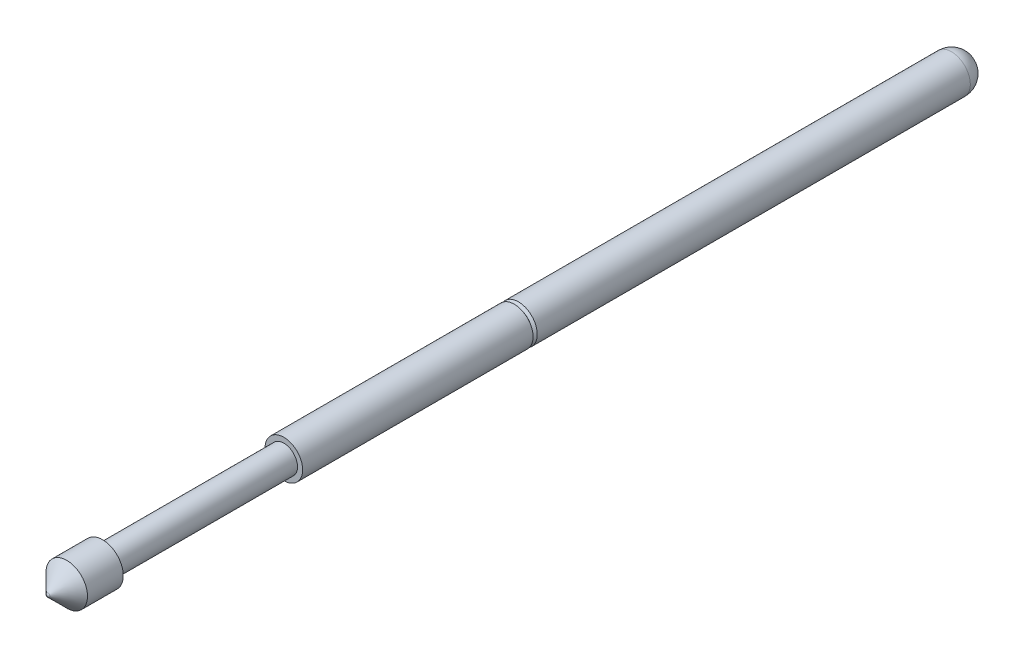
ISO-10303-21;
HEADER;
FILE_DESCRIPTION(('STEP AP214'),'2;1');
FILE_NAME('part.step','',(''),(''),'','','');
FILE_SCHEMA(('AUTOMOTIVE_DESIGN { 1 0 10303 214 1 1 1 1 }'));
ENDSEC;
DATA;
#1=APPLICATION_CONTEXT('core data for automotive mechanical design processes');
#2=APPLICATION_PROTOCOL_DEFINITION('international standard','automotive_design',2000,#1);
#3=PRODUCT_CONTEXT('',#1,'mechanical');
#4=PRODUCT('Part','Part','',(#3));
#5=PRODUCT_RELATED_PRODUCT_CATEGORY('part','',(#4));
#6=PRODUCT_DEFINITION_FORMATION('','',#4);
#7=PRODUCT_DEFINITION_CONTEXT('part definition',#1,'design');
#8=PRODUCT_DEFINITION('design','',#6,#7);
#9=PRODUCT_DEFINITION_SHAPE('','',#8);
#10=(LENGTH_UNIT() NAMED_UNIT(*) SI_UNIT(.MILLI.,.METRE.));
#11=(NAMED_UNIT(*) PLANE_ANGLE_UNIT() SI_UNIT($,.RADIAN.));
#12=(NAMED_UNIT(*) SI_UNIT($,.STERADIAN.) SOLID_ANGLE_UNIT());
#13=UNCERTAINTY_MEASURE_WITH_UNIT(LENGTH_MEASURE(1.E-05),#10,'distance_accuracy_value','');
#14=(GEOMETRIC_REPRESENTATION_CONTEXT(3) GLOBAL_UNCERTAINTY_ASSIGNED_CONTEXT((#13)) GLOBAL_UNIT_ASSIGNED_CONTEXT((#10,
#11,#12)) REPRESENTATION_CONTEXT('',''));
#15=CARTESIAN_POINT('',(0.,0.,0.));
#16=DIRECTION('',(0.,0.,1.));
#17=DIRECTION('',(1.,0.,0.));
#18=AXIS2_PLACEMENT_3D('',#15,#16,#17);
#19=CARTESIAN_POINT('',(0.,0.,0.680000000000002));
#20=DIRECTION('',(0.,0.,-1.));
#21=DIRECTION('',(-1.,0.,0.));
#22=AXIS2_PLACEMENT_3D('',#19,#20,#21);
#23=SPHERICAL_SURFACE('',#22,0.680000000000002);
#24=CARTESIAN_POINT('',(0.,0.,0.680000000000002));
#25=DIRECTION('',(0.,0.,-1.));
#26=DIRECTION('',(-1.,0.,0.));
#27=AXIS2_PLACEMENT_3D('',#24,#25,#26);
#28=CIRCLE('',#27,0.680000000000002);
#29=CARTESIAN_POINT('',(-0.680000000000002,0.,0.680000000000002));
#30=VERTEX_POINT('',#29);
#31=EDGE_CURVE('E67',#30,#30,#28,.T.);
#32=ORIENTED_EDGE('',*,*,#31,.T.);
#33=EDGE_LOOP('',(#32));
#34=FACE_BOUND('',#33,.T.);
#35=ADVANCED_FACE('F33',(#34),#23,.T.);
#36=CARTESIAN_POINT('',(0.,0.,33.25));
#37=DIRECTION('',(0.,0.,-1.));
#38=DIRECTION('',(-1.,0.,0.));
#39=AXIS2_PLACEMENT_3D('',#36,#37,#38);
#40=SPHERICAL_SURFACE('',#39,0.100000000000001);
#41=CARTESIAN_POINT('',(0.,0.,33.3207106781187));
#42=DIRECTION('',(0.,0.,-1.));
#43=DIRECTION('',(-1.,0.,0.));
#44=AXIS2_PLACEMENT_3D('',#41,#42,#43);
#45=CIRCLE('',#44,0.0707106781186528);
#46=CARTESIAN_POINT('',(-0.0707106781186492,0.,33.3207106781187));
#47=VERTEX_POINT('',#46);
#48=EDGE_CURVE('E10',#47,#47,#45,.T.);
#49=ORIENTED_EDGE('',*,*,#48,.F.);
#50=EDGE_LOOP('',(#49));
#51=FACE_BOUND('',#50,.T.);
#52=ADVANCED_FACE('F84',(#51),#40,.T.);
#53=CARTESIAN_POINT('',(0.,0.,32.6414213562373));
#54=DIRECTION('',(0.,0.,-1.));
#55=DIRECTION('',(-1.,0.,0.));
#56=AXIS2_PLACEMENT_3D('',#53,#54,#55);
#57=CONICAL_SURFACE('',#56,0.749999999999996,0.78539816339744);
#58=CARTESIAN_POINT('',(0.,0.,32.6414213562373));
#59=DIRECTION('',(0.,0.,-1.));
#60=DIRECTION('',(-1.,0.,0.));
#61=AXIS2_PLACEMENT_3D('',#58,#59,#60);
#62=CIRCLE('',#61,0.749999999999996);
#63=CARTESIAN_POINT('',(-0.749999999999993,0.,32.6414213562373));
#64=VERTEX_POINT('',#63);
#65=EDGE_CURVE('E39',#64,#64,#62,.T.);
#66=CARTESIAN_POINT('',(-0.0707106781186492,0.,33.3207106781187));
#67=CARTESIAN_POINT('',(-0.077786608554915,0.,33.3136347476824));
#68=CARTESIAN_POINT('',(-0.0848625389911784,0.,33.3065588172461));
#69=CARTESIAN_POINT('',(-0.0990143998637052,0.,33.2924069563736));
#70=CARTESIAN_POINT('',(-0.106090330299969,0.,33.2853310259373));
#71=CARTESIAN_POINT('',(-0.120242191172497,0.,33.2711791650648));
#72=CARTESIAN_POINT('',(-0.127318121608761,0.,33.2641032346285));
#73=CARTESIAN_POINT('',(-0.14146998248129,0.,33.249951373756));
#74=CARTESIAN_POINT('',(-0.148545912917554,0.,33.2428754433197));
#75=CARTESIAN_POINT('',(-0.162697773790081,0.,33.2287235824472));
#76=CARTESIAN_POINT('',(-0.169773704226344,0.,33.221647652011));
#77=CARTESIAN_POINT('',(-0.183925565098873,0.,33.2074957911384));
#78=CARTESIAN_POINT('',(-0.191001495535138,0.,33.2004198607022));
#79=CARTESIAN_POINT('',(-0.205153356407666,0.,33.1862679998296));
#80=CARTESIAN_POINT('',(-0.212229286843929,0.,33.1791920693934));
#81=CARTESIAN_POINT('',(-0.226381147716456,0.,33.1650402085208));
#82=CARTESIAN_POINT('',(-0.233457078152721,0.,33.1579642780846));
#83=CARTESIAN_POINT('',(-0.24760893902525,0.,33.1438124172121));
#84=CARTESIAN_POINT('',(-0.254684869461513,0.,33.1367364867758));
#85=CARTESIAN_POINT('',(-0.268836730334041,0.,33.1225846259033));
#86=CARTESIAN_POINT('',(-0.275912660770304,0.,33.115508695467));
#87=CARTESIAN_POINT('',(-0.290064521642833,0.,33.1013568345945));
#88=CARTESIAN_POINT('',(-0.297140452079097,0.,33.0942809041582));
#89=CARTESIAN_POINT('',(-0.311292312951626,0.,33.0801290432857));
#90=CARTESIAN_POINT('',(-0.318368243387889,0.,33.0730531128494));
#91=CARTESIAN_POINT('',(-0.332520104260417,0.,33.0589012519769));
#92=CARTESIAN_POINT('',(-0.33959603469668,0.,33.0518253215406));
#93=CARTESIAN_POINT('',(-0.353747895569209,0.,33.0376734606681));
#94=CARTESIAN_POINT('',(-0.360823826005473,0.,33.0305975302318));
#95=CARTESIAN_POINT('',(-0.374975686878002,0.,33.0164456693593));
#96=CARTESIAN_POINT('',(-0.382051617314265,0.,33.009369738923));
#97=CARTESIAN_POINT('',(-0.396203478186792,0.,32.9952178780505));
#98=CARTESIAN_POINT('',(-0.403279408623056,0.,32.9881419476142));
#99=CARTESIAN_POINT('',(-0.417431269495585,0.,32.9739900867417));
#100=CARTESIAN_POINT('',(-0.42450719993185,0.,32.9669141563054));
#101=CARTESIAN_POINT('',(-0.438659060804377,0.,32.9527622954329));
#102=CARTESIAN_POINT('',(-0.44573499124064,0.,32.9456863649967));
#103=CARTESIAN_POINT('',(-0.459886852113168,0.,32.9315345041241));
#104=CARTESIAN_POINT('',(-0.466962782549433,0.,32.9244585736879));
#105=CARTESIAN_POINT('',(-0.481114643421962,0.,32.9103067128153));
#106=CARTESIAN_POINT('',(-0.488190573858225,0.,32.9032307823791));
#107=CARTESIAN_POINT('',(-0.502342434730752,0.,32.8890789215065));
#108=CARTESIAN_POINT('',(-0.509418365167016,0.,32.8820029910703));
#109=CARTESIAN_POINT('',(-0.523570226039544,0.,32.8678511301977));
#110=CARTESIAN_POINT('',(-0.530646156475809,0.,32.8607751997615));
#111=CARTESIAN_POINT('',(-0.544798017348337,0.,32.846623338889));
#112=CARTESIAN_POINT('',(-0.5518739477846,0.,32.8395474084527));
#113=CARTESIAN_POINT('',(-0.566025808657128,0.,32.8253955475802));
#114=CARTESIAN_POINT('',(-0.573101739093393,0.,32.8183196171439));
#115=CARTESIAN_POINT('',(-0.587253599965922,0.,32.8041677562714));
#116=CARTESIAN_POINT('',(-0.594329530402185,0.,32.7970918258351));
#117=CARTESIAN_POINT('',(-0.608481391274712,0.,32.7829399649626));
#118=CARTESIAN_POINT('',(-0.615557321710976,0.,32.7758640345263));
#119=CARTESIAN_POINT('',(-0.629709182583504,0.,32.7617121736538));
#120=CARTESIAN_POINT('',(-0.636785113019769,0.,32.7546362432175));
#121=CARTESIAN_POINT('',(-0.650936973892297,0.,32.740484382345));
#122=CARTESIAN_POINT('',(-0.658012904328561,0.,32.7334084519087));
#123=CARTESIAN_POINT('',(-0.672164765201088,0.,32.7192565910362));
#124=CARTESIAN_POINT('',(-0.679240695637352,0.,32.7121806605999));
#125=CARTESIAN_POINT('',(-0.69339255650988,0.,32.6980287997274));
#126=CARTESIAN_POINT('',(-0.700468486946145,0.,32.6909528692911));
#127=CARTESIAN_POINT('',(-0.714620347818673,0.,32.6768010084186));
#128=CARTESIAN_POINT('',(-0.721696278254937,0.,32.6697250779824));
#129=CARTESIAN_POINT('',(-0.735848139127464,0.,32.6555732171098));
#130=CARTESIAN_POINT('',(-0.742924069563728,0.,32.6484972866736));
#131=CARTESIAN_POINT('',(-0.749999999999993,0.,32.6414213562373));
#132=B_SPLINE_CURVE_WITH_KNOTS('',3,(#66,#67,#68,#69,#70,#71,#72,#73,#74,#75,#76,#77,#78,#79,
#80,#81,#82,#83,#84,#85,#86,#87,#88,#89,#90,#91,#92,#93,#94,#95,#96,#97,#98,#99,#100,#101,#102,
#103,#104,#105,#106,#107,#108,#109,#110,#111,#112,#113,#114,#115,#116,#117,#118,#119,#120,#121,
#122,#123,#124,#125,#126,#127,#128,#129,#130,#131),.UNSPECIFIED.,.F.,.F.,(4,2,2,2,2,2,2,2,2,2,2,
2,2,2,2,2,2,2,2,2,2,2,2,2,2,2,2,2,2,2,2,2,4),(0.,0.0300206303681165,0.060041260736238,
0.0900618911043544,0.120082521472476,0.150103151840597,0.180123782208714,0.210144412576835,
0.240165042944952,0.270185673313073,0.300206303681195,0.330226934049311,0.360247564417432,
0.390268194785554,0.42028882515367,0.450309455521792,0.480330085889913,0.51035071625803,
0.540371346626151,0.570391976994268,0.600412607362389,0.630433237730511,0.660453868098627,
0.690474498466748,0.720495128834865,0.750515759202987,0.780536389571108,0.810557019939224,
0.840577650307346,0.870598280675467,0.900618911043584,0.930639541411705,0.960660171779827),.UNSPECIFIED.);
#133=EDGE_CURVE('BSEAM88',#47,#64,#132,.T.);
#134=ORIENTED_EDGE('',*,*,#48,.T.);
#135=ORIENTED_EDGE('',*,*,#65,.F.);
#136=ORIENTED_EDGE('',*,*,#133,.T.);
#137=ORIENTED_EDGE('',*,*,#133,.F.);
#138=EDGE_LOOP('',(#134,#136,#135,#137));
#139=FACE_BOUND('',#138,.T.);
#140=ADVANCED_FACE('F88',(#139),#57,.T.);
#141=CARTESIAN_POINT('',(0.,0.,0.));
#142=DIRECTION('',(0.,0.,-1.));
#143=DIRECTION('',(-1.,0.,0.));
#144=AXIS2_PLACEMENT_3D('',#141,#142,#143);
#145=CYLINDRICAL_SURFACE('',#144,0.749999999999996);
#146=ORIENTED_EDGE('',*,*,#65,.T.);
#147=EDGE_LOOP('',(#146));
#148=FACE_BOUND('',#147,.T.);
#149=CARTESIAN_POINT('',(0.,0.,31.35));
#150=DIRECTION('',(0.,0.,-1.));
#151=DIRECTION('',(-1.,0.,0.));
#152=AXIS2_PLACEMENT_3D('',#149,#150,#151);
#153=CIRCLE('',#152,0.749999999999996);
#154=CARTESIAN_POINT('',(-0.749999999999996,0.,31.35));
#155=VERTEX_POINT('',#154);
#156=EDGE_CURVE('E43',#155,#155,#153,.T.);
#157=ORIENTED_EDGE('',*,*,#156,.F.);
#158=EDGE_LOOP('',(#157));
#159=FACE_BOUND('',#158,.T.);
#160=ADVANCED_FACE('F93',(#148,#159),#145,.T.);
#161=CARTESIAN_POINT('',(-0.749999999999996,0.,31.35));
#162=DIRECTION('',(0.,0.,-1.));
#163=DIRECTION('',(-1.,0.,0.));
#164=AXIS2_PLACEMENT_3D('',#161,#162,#163);
#165=PLANE('',#164);
#166=ORIENTED_EDGE('',*,*,#156,.T.);
#167=EDGE_LOOP('',(#166));
#168=FACE_BOUND('',#167,.T.);
#169=CARTESIAN_POINT('',(0.,0.,31.35));
#170=DIRECTION('',(0.,0.,-1.));
#171=DIRECTION('',(-1.,0.,0.));
#172=AXIS2_PLACEMENT_3D('',#169,#170,#171);
#173=CIRCLE('',#172,0.494999999999996);
#174=CARTESIAN_POINT('',(-0.494999999999996,0.,31.35));
#175=VERTEX_POINT('',#174);
#176=EDGE_CURVE('E47',#175,#175,#173,.T.);
#177=ORIENTED_EDGE('',*,*,#176,.F.);
#178=EDGE_LOOP('',(#177));
#179=FACE_BOUND('',#178,.T.);
#180=ADVANCED_FACE('F98',(#168,#179),#165,.T.);
#181=CARTESIAN_POINT('',(0.,0.,0.));
#182=DIRECTION('',(0.,0.,-1.));
#183=DIRECTION('',(-1.,0.,0.));
#184=AXIS2_PLACEMENT_3D('',#181,#182,#183);
#185=CYLINDRICAL_SURFACE('',#184,0.494999999999996);
#186=ORIENTED_EDGE('',*,*,#176,.T.);
#187=EDGE_LOOP('',(#186));
#188=FACE_BOUND('',#187,.T.);
#189=CARTESIAN_POINT('',(0.,0.,24.8));
#190=DIRECTION('',(0.,0.,-1.));
#191=DIRECTION('',(-1.,0.,0.));
#192=AXIS2_PLACEMENT_3D('',#189,#190,#191);
#193=CIRCLE('',#192,0.494999999999996);
#194=CARTESIAN_POINT('',(-0.494999999999996,0.,24.8));
#195=VERTEX_POINT('',#194);
#196=EDGE_CURVE('E52',#195,#195,#193,.T.);
#197=ORIENTED_EDGE('',*,*,#196,.F.);
#198=EDGE_LOOP('',(#197));
#199=FACE_BOUND('',#198,.T.);
#200=ADVANCED_FACE('F101',(#188,#199),#185,.T.);
#201=CARTESIAN_POINT('',(-0.494999999999996,0.,24.8));
#202=DIRECTION('',(0.,0.,1.));
#203=DIRECTION('',(1.,0.,0.));
#204=AXIS2_PLACEMENT_3D('',#201,#202,#203);
#205=PLANE('',#204);
#206=ORIENTED_EDGE('',*,*,#196,.T.);
#207=EDGE_LOOP('',(#206));
#208=FACE_BOUND('',#207,.T.);
#209=CARTESIAN_POINT('',(0.,0.,24.8));
#210=DIRECTION('',(0.,0.,-1.));
#211=DIRECTION('',(-1.,0.,0.));
#212=AXIS2_PLACEMENT_3D('',#209,#210,#211);
#213=CIRCLE('',#212,0.679999999999997);
#214=CARTESIAN_POINT('',(-0.679999999999997,0.,24.8));
#215=VERTEX_POINT('',#214);
#216=EDGE_CURVE('E55',#215,#215,#213,.T.);
#217=ORIENTED_EDGE('',*,*,#216,.F.);
#218=EDGE_LOOP('',(#217));
#219=FACE_BOUND('',#218,.T.);
#220=ADVANCED_FACE('F105',(#208,#219),#205,.T.);
#221=CARTESIAN_POINT('',(0.,0.,0.));
#222=DIRECTION('',(0.,0.,-1.));
#223=DIRECTION('',(-1.,0.,0.));
#224=AXIS2_PLACEMENT_3D('',#221,#222,#223);
#225=CYLINDRICAL_SURFACE('',#224,0.679999999999998);
#226=ORIENTED_EDGE('',*,*,#216,.T.);
#227=EDGE_LOOP('',(#226));
#228=FACE_BOUND('',#227,.T.);
#229=CARTESIAN_POINT('',(0.,0.,16.475));
#230=DIRECTION('',(0.,0.,-1.));
#231=DIRECTION('',(-1.,0.,0.));
#232=AXIS2_PLACEMENT_3D('',#229,#230,#231);
#233=CIRCLE('',#232,0.68);
#234=CARTESIAN_POINT('',(-0.68,0.,16.475));
#235=VERTEX_POINT('',#234);
#236=EDGE_CURVE('E58',#235,#235,#233,.T.);
#237=ORIENTED_EDGE('',*,*,#236,.F.);
#238=EDGE_LOOP('',(#237));
#239=FACE_BOUND('',#238,.T.);
#240=ADVANCED_FACE('F109',(#228,#239),#225,.T.);
#241=CARTESIAN_POINT('',(0.,0.,16.4));
#242=DIRECTION('',(0.,0.,1.));
#243=DIRECTION('',(1.,0.,0.));
#244=AXIS2_PLACEMENT_3D('',#241,#242,#243);
#245=CONICAL_SURFACE('',#244,0.579289321881343,0.930691014621459);
#246=ORIENTED_EDGE('',*,*,#236,.T.);
#247=EDGE_LOOP('',(#246));
#248=FACE_BOUND('',#247,.T.);
#249=CARTESIAN_POINT('',(0.,0.,16.4));
#250=DIRECTION('',(0.,0.,-1.));
#251=DIRECTION('',(-1.,0.,0.));
#252=AXIS2_PLACEMENT_3D('',#249,#250,#251);
#253=CIRCLE('',#252,0.579289321881343);
#254=CARTESIAN_POINT('',(-0.579289321881343,0.,16.4));
#255=VERTEX_POINT('',#254);
#256=EDGE_CURVE('E61',#255,#255,#253,.T.);
#257=ORIENTED_EDGE('',*,*,#256,.F.);
#258=EDGE_LOOP('',(#257));
#259=FACE_BOUND('',#258,.T.);
#260=ADVANCED_FACE('F80',(#248,#259),#245,.T.);
#261=CARTESIAN_POINT('',(0.,0.,16.325));
#262=DIRECTION('',(0.,0.,-1.));
#263=DIRECTION('',(-1.,0.,0.));
#264=AXIS2_PLACEMENT_3D('',#261,#262,#263);
#265=CONICAL_SURFACE('',#264,0.68,0.930691014621481);
#266=ORIENTED_EDGE('',*,*,#256,.T.);
#267=EDGE_LOOP('',(#266));
#268=FACE_BOUND('',#267,.T.);
#269=CARTESIAN_POINT('',(0.,0.,16.325));
#270=DIRECTION('',(0.,0.,-1.));
#271=DIRECTION('',(-1.,0.,0.));
#272=AXIS2_PLACEMENT_3D('',#269,#270,#271);
#273=CIRCLE('',#272,0.68);
#274=CARTESIAN_POINT('',(-0.68,0.,16.325));
#275=VERTEX_POINT('',#274);
#276=EDGE_CURVE('E64',#275,#275,#273,.T.);
#277=ORIENTED_EDGE('',*,*,#276,.F.);
#278=EDGE_LOOP('',(#277));
#279=FACE_BOUND('',#278,.T.);
#280=ADVANCED_FACE('F74',(#268,#279),#265,.T.);
#281=CARTESIAN_POINT('',(0.,0.,0.));
#282=DIRECTION('',(0.,0.,-1.));
#283=DIRECTION('',(-1.,0.,0.));
#284=AXIS2_PLACEMENT_3D('',#281,#282,#283);
#285=CYLINDRICAL_SURFACE('',#284,0.680000000000001);
#286=ORIENTED_EDGE('',*,*,#276,.T.);
#287=EDGE_LOOP('',(#286));
#288=FACE_BOUND('',#287,.T.);
#289=ORIENTED_EDGE('',*,*,#31,.F.);
#290=EDGE_LOOP('',(#289));
#291=FACE_BOUND('',#290,.T.);
#292=ADVANCED_FACE('F72',(#288,#291),#285,.T.);
#293=CLOSED_SHELL('',(#35,#52,#140,#160,#180,#200,#220,#240,#260,#280,#292));
#294=MANIFOLD_SOLID_BREP('B2',#293);
#295=ADVANCED_BREP_SHAPE_REPRESENTATION('',(#18,#294),#14);
#296=SHAPE_DEFINITION_REPRESENTATION(#9,#295);
ENDSEC;
END-ISO-10303-21;
